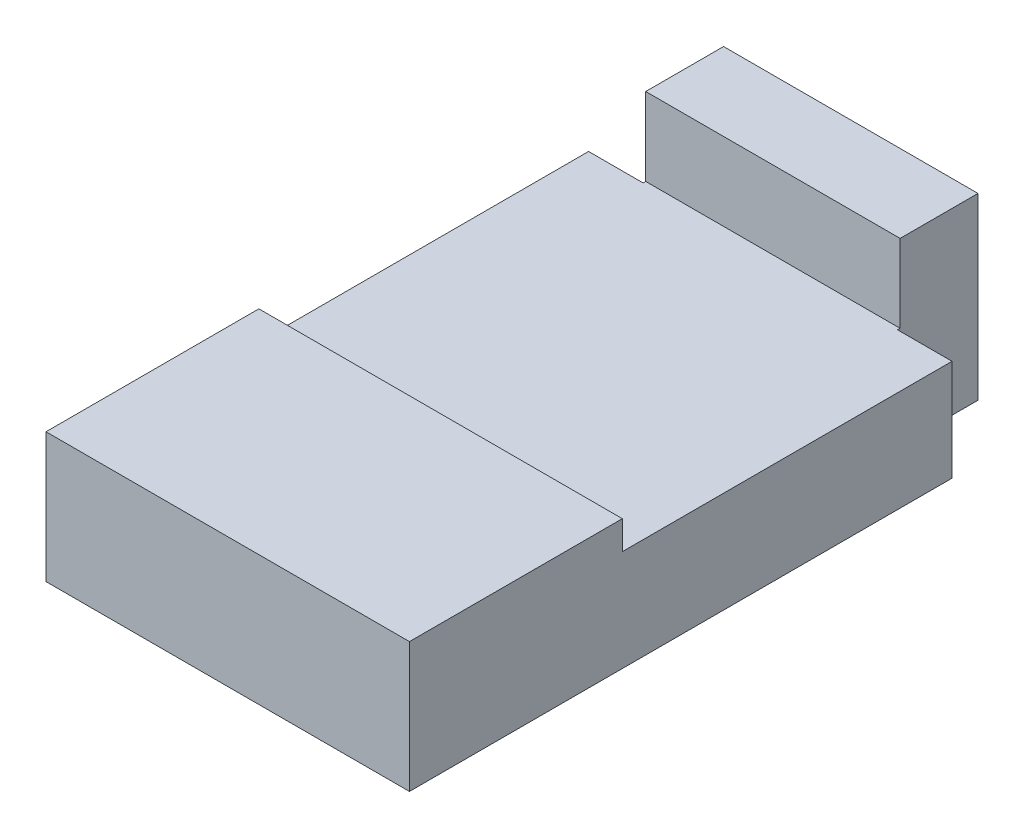
ISO-10303-21;
HEADER;
FILE_DESCRIPTION(('STEP AP214'),'2;1');
FILE_NAME('part.step','',(''),(''),'','','');
FILE_SCHEMA(('AUTOMOTIVE_DESIGN { 1 0 10303 214 1 1 1 1 }'));
ENDSEC;
DATA;
#1=APPLICATION_CONTEXT('core data for automotive mechanical design processes');
#2=APPLICATION_PROTOCOL_DEFINITION('international standard','automotive_design',2000,#1);
#3=PRODUCT_CONTEXT('',#1,'mechanical');
#4=PRODUCT('Part','Part','',(#3));
#5=PRODUCT_RELATED_PRODUCT_CATEGORY('part','',(#4));
#6=PRODUCT_DEFINITION_FORMATION('','',#4);
#7=PRODUCT_DEFINITION_CONTEXT('part definition',#1,'design');
#8=PRODUCT_DEFINITION('design','',#6,#7);
#9=PRODUCT_DEFINITION_SHAPE('','',#8);
#10=(LENGTH_UNIT() NAMED_UNIT(*) SI_UNIT(.MILLI.,.METRE.));
#11=(NAMED_UNIT(*) PLANE_ANGLE_UNIT() SI_UNIT($,.RADIAN.));
#12=(NAMED_UNIT(*) SI_UNIT($,.STERADIAN.) SOLID_ANGLE_UNIT());
#13=UNCERTAINTY_MEASURE_WITH_UNIT(LENGTH_MEASURE(1.E-05),#10,'distance_accuracy_value','');
#14=(GEOMETRIC_REPRESENTATION_CONTEXT(3) GLOBAL_UNCERTAINTY_ASSIGNED_CONTEXT((#13)) GLOBAL_UNIT_ASSIGNED_CONTEXT((#10,
#11,#12)) REPRESENTATION_CONTEXT('',''));
#15=CARTESIAN_POINT('',(0.,0.,0.));
#16=DIRECTION('',(0.,0.,1.));
#17=DIRECTION('',(1.,0.,0.));
#18=AXIS2_PLACEMENT_3D('',#15,#16,#17);
#19=CARTESIAN_POINT('',(-2.45,0.975,-3.));
#20=DIRECTION('',(0.,1.,0.));
#21=DIRECTION('',(0.,0.,1.));
#22=AXIS2_PLACEMENT_3D('',#19,#20,#21);
#23=PLANE('',#22);
#24=DIRECTION('',(0.,0.,1.));
#25=VECTOR('',#24,1.);
#26=CARTESIAN_POINT('',(-3.5,0.975,9.));
#27=LINE('',#26,#25);
#28=CARTESIAN_POINT('',(-3.5,0.975,-1.45));
#29=VERTEX_POINT('',#28);
#30=CARTESIAN_POINT('',(-3.5,0.975,4.9));
#31=VERTEX_POINT('',#30);
#32=EDGE_CURVE('E156',#29,#31,#27,.T.);
#33=ORIENTED_EDGE('',*,*,#32,.T.);
#34=DIRECTION('',(-1.,0.,0.));
#35=VECTOR('',#34,1.);
#36=CARTESIAN_POINT('',(-3.5,0.975,4.9));
#37=LINE('',#36,#35);
#38=CARTESIAN_POINT('',(3.5,0.975,4.9));
#39=VERTEX_POINT('',#38);
#40=EDGE_CURVE('E145',#39,#31,#37,.T.);
#41=ORIENTED_EDGE('',*,*,#40,.F.);
#42=DIRECTION('',(0.,0.,1.));
#43=VECTOR('',#42,1.);
#44=CARTESIAN_POINT('',(3.5,0.975,9.));
#45=LINE('',#44,#43);
#46=CARTESIAN_POINT('',(3.5,0.975,-1.45));
#47=VERTEX_POINT('',#46);
#48=EDGE_CURVE('E160',#47,#39,#45,.T.);
#49=ORIENTED_EDGE('',*,*,#48,.F.);
#50=DIRECTION('',(-1.,0.,0.));
#51=VECTOR('',#50,1.);
#52=CARTESIAN_POINT('',(3.5,0.975,-1.45));
#53=LINE('',#52,#51);
#54=CARTESIAN_POINT('',(2.45,0.975,-1.45));
#55=VERTEX_POINT('',#54);
#56=EDGE_CURVE('E170',#47,#55,#53,.T.);
#57=ORIENTED_EDGE('',*,*,#56,.T.);
#58=DIRECTION('',(0.,0.,1.));
#59=VECTOR('',#58,1.);
#60=CARTESIAN_POINT('',(2.45,0.975,-3.));
#61=LINE('',#60,#59);
#62=CARTESIAN_POINT('',(2.45,0.975,-1.5));
#63=VERTEX_POINT('',#62);
#64=EDGE_CURVE('E36',#63,#55,#61,.T.);
#65=ORIENTED_EDGE('',*,*,#64,.F.);
#66=DIRECTION('',(1.,0.,0.));
#67=VECTOR('',#66,1.);
#68=CARTESIAN_POINT('',(-2.45,0.975,-1.5));
#69=LINE('',#68,#67);
#70=CARTESIAN_POINT('',(-2.45,0.975,-1.5));
#71=VERTEX_POINT('',#70);
#72=EDGE_CURVE('E181',#71,#63,#69,.T.);
#73=ORIENTED_EDGE('',*,*,#72,.F.);
#74=DIRECTION('',(0.,0.,1.));
#75=VECTOR('',#74,1.);
#76=CARTESIAN_POINT('',(-2.45,0.975,-3.));
#77=LINE('',#76,#75);
#78=CARTESIAN_POINT('',(-2.45,0.975,-1.45));
#79=VERTEX_POINT('',#78);
#80=EDGE_CURVE('E211',#71,#79,#77,.T.);
#81=ORIENTED_EDGE('',*,*,#80,.T.);
#82=EDGE_CURVE('E162',#79,#29,#53,.T.);
#83=ORIENTED_EDGE('',*,*,#82,.T.);
#84=EDGE_LOOP('',(#33,#41,#49,#57,#65,#73,#81,#83));
#85=FACE_BOUND('',#84,.T.);
#86=ADVANCED_FACE('F32',(#85),#23,.T.);
#87=CARTESIAN_POINT('',(2.45,-0.975,-3.));
#88=DIRECTION('',(1.,0.,0.));
#89=DIRECTION('',(0.,0.,-1.));
#90=AXIS2_PLACEMENT_3D('',#87,#88,#89);
#91=PLANE('',#90);
#92=ORIENTED_EDGE('',*,*,#64,.T.);
#93=DIRECTION('',(0.,-1.,0.));
#94=VECTOR('',#93,1.);
#95=CARTESIAN_POINT('',(2.45,-0.975,-1.45));
#96=LINE('',#95,#94);
#97=CARTESIAN_POINT('',(2.45,-0.975,-1.45));
#98=VERTEX_POINT('',#97);
#99=EDGE_CURVE('E49',#55,#98,#96,.T.);
#100=ORIENTED_EDGE('',*,*,#99,.T.);
#101=DIRECTION('',(0.,0.,1.));
#102=VECTOR('',#101,1.);
#103=CARTESIAN_POINT('',(2.45,-0.975,-3.));
#104=LINE('',#103,#102);
#105=CARTESIAN_POINT('',(2.45,-0.975,-3.));
#106=VERTEX_POINT('',#105);
#107=EDGE_CURVE('E11',#106,#98,#104,.T.);
#108=ORIENTED_EDGE('',*,*,#107,.F.);
#109=DIRECTION('',(0.,1.,0.));
#110=VECTOR('',#109,1.);
#111=CARTESIAN_POINT('',(2.45,-0.975,-3.));
#112=LINE('',#111,#110);
#113=CARTESIAN_POINT('',(2.45,2.475,-3.));
#114=VERTEX_POINT('',#113);
#115=EDGE_CURVE('E202',#106,#114,#112,.T.);
#116=ORIENTED_EDGE('',*,*,#115,.T.);
#117=DIRECTION('',(0.,0.,-1.));
#118=VECTOR('',#117,1.);
#119=CARTESIAN_POINT('',(2.45,2.475,-3.));
#120=LINE('',#119,#118);
#121=CARTESIAN_POINT('',(2.45,2.475,-1.5));
#122=VERTEX_POINT('',#121);
#123=EDGE_CURVE('E187',#122,#114,#120,.T.);
#124=ORIENTED_EDGE('',*,*,#123,.F.);
#125=DIRECTION('',(0.,-1.,0.));
#126=VECTOR('',#125,1.);
#127=CARTESIAN_POINT('',(2.45,2.475,-1.5));
#128=LINE('',#127,#126);
#129=EDGE_CURVE('E193',#122,#63,#128,.T.);
#130=ORIENTED_EDGE('',*,*,#129,.T.);
#131=EDGE_LOOP('',(#92,#100,#108,#116,#124,#130));
#132=FACE_BOUND('',#131,.T.);
#133=ADVANCED_FACE('F34',(#132),#91,.T.);
#134=CARTESIAN_POINT('',(-2.45,-0.975,-3.));
#135=DIRECTION('',(-1.,0.,0.));
#136=DIRECTION('',(0.,0.,1.));
#137=AXIS2_PLACEMENT_3D('',#134,#135,#136);
#138=PLANE('',#137);
#139=DIRECTION('',(0.,0.,1.));
#140=VECTOR('',#139,1.);
#141=CARTESIAN_POINT('',(-2.45,-0.975,-3.));
#142=LINE('',#141,#140);
#143=CARTESIAN_POINT('',(-2.45,-0.975,-3.));
#144=VERTEX_POINT('',#143);
#145=CARTESIAN_POINT('',(-2.45,-0.975,-1.45));
#146=VERTEX_POINT('',#145);
#147=EDGE_CURVE('E41',#144,#146,#142,.T.);
#148=ORIENTED_EDGE('',*,*,#147,.T.);
#149=DIRECTION('',(0.,1.,0.));
#150=VECTOR('',#149,1.);
#151=CARTESIAN_POINT('',(-2.45,-0.975,-1.45));
#152=LINE('',#151,#150);
#153=EDGE_CURVE('E177',#146,#79,#152,.T.);
#154=ORIENTED_EDGE('',*,*,#153,.T.);
#155=ORIENTED_EDGE('',*,*,#80,.F.);
#156=DIRECTION('',(0.,-1.,0.));
#157=VECTOR('',#156,1.);
#158=CARTESIAN_POINT('',(-2.45,2.475,-1.5));
#159=LINE('',#158,#157);
#160=CARTESIAN_POINT('',(-2.45,2.475,-1.5));
#161=VERTEX_POINT('',#160);
#162=EDGE_CURVE('E197',#161,#71,#159,.T.);
#163=ORIENTED_EDGE('',*,*,#162,.F.);
#164=DIRECTION('',(0.,0.,1.));
#165=VECTOR('',#164,1.);
#166=CARTESIAN_POINT('',(-2.45,2.475,-3.));
#167=LINE('',#166,#165);
#168=CARTESIAN_POINT('',(-2.45,2.475,-3.));
#169=VERTEX_POINT('',#168);
#170=EDGE_CURVE('E182',#169,#161,#167,.T.);
#171=ORIENTED_EDGE('',*,*,#170,.F.);
#172=DIRECTION('',(0.,-1.,0.));
#173=VECTOR('',#172,1.);
#174=CARTESIAN_POINT('',(-2.45,-0.975,-3.));
#175=LINE('',#174,#173);
#176=EDGE_CURVE('E204',#169,#144,#175,.T.);
#177=ORIENTED_EDGE('',*,*,#176,.T.);
#178=EDGE_LOOP('',(#148,#154,#155,#163,#171,#177));
#179=FACE_BOUND('',#178,.T.);
#180=ADVANCED_FACE('F217',(#179),#138,.T.);
#181=CARTESIAN_POINT('',(-2.45,-0.975,-3.));
#182=DIRECTION('',(0.,-1.,0.));
#183=DIRECTION('',(0.,0.,-1.));
#184=AXIS2_PLACEMENT_3D('',#181,#182,#183);
#185=PLANE('',#184);
#186=DIRECTION('',(-1.,0.,0.));
#187=VECTOR('',#186,1.);
#188=CARTESIAN_POINT('',(3.5,-0.975,-1.45));
#189=LINE('',#188,#187);
#190=CARTESIAN_POINT('',(-3.5,-0.975,-1.45));
#191=VERTEX_POINT('',#190);
#192=EDGE_CURVE('E173',#146,#191,#189,.T.);
#193=ORIENTED_EDGE('',*,*,#192,.F.);
#194=ORIENTED_EDGE('',*,*,#147,.F.);
#195=DIRECTION('',(1.,0.,0.));
#196=VECTOR('',#195,1.);
#197=CARTESIAN_POINT('',(-2.45,-0.975,-3.));
#198=LINE('',#197,#196);
#199=EDGE_CURVE('E207',#144,#106,#198,.T.);
#200=ORIENTED_EDGE('',*,*,#199,.T.);
#201=ORIENTED_EDGE('',*,*,#107,.T.);
#202=CARTESIAN_POINT('',(3.5,-0.975,-1.45));
#203=VERTEX_POINT('',#202);
#204=EDGE_CURVE('E174',#203,#98,#189,.T.);
#205=ORIENTED_EDGE('',*,*,#204,.F.);
#206=DIRECTION('',(0.,0.,-1.));
#207=VECTOR('',#206,1.);
#208=CARTESIAN_POINT('',(3.5,-0.975,9.));
#209=LINE('',#208,#207);
#210=CARTESIAN_POINT('',(3.5,-0.975,9.));
#211=VERTEX_POINT('',#210);
#212=EDGE_CURVE('E155',#211,#203,#209,.T.);
#213=ORIENTED_EDGE('',*,*,#212,.F.);
#214=DIRECTION('',(1.,0.,0.));
#215=VECTOR('',#214,1.);
#216=CARTESIAN_POINT('',(-2.45,-0.975,9.));
#217=LINE('',#216,#215);
#218=CARTESIAN_POINT('',(-3.5,-0.975,9.));
#219=VERTEX_POINT('',#218);
#220=EDGE_CURVE('E200',#219,#211,#217,.T.);
#221=ORIENTED_EDGE('',*,*,#220,.F.);
#222=DIRECTION('',(0.,0.,-1.));
#223=VECTOR('',#222,1.);
#224=CARTESIAN_POINT('',(-3.5,-0.975,9.));
#225=LINE('',#224,#223);
#226=EDGE_CURVE('E128',#219,#191,#225,.T.);
#227=ORIENTED_EDGE('',*,*,#226,.T.);
#228=EDGE_LOOP('',(#193,#194,#200,#201,#205,#213,#221,#227));
#229=FACE_BOUND('',#228,.T.);
#230=ADVANCED_FACE('F232',(#229),#185,.T.);
#231=CARTESIAN_POINT('',(0.,0.,-3.));
#232=DIRECTION('',(0.,0.,-1.));
#233=DIRECTION('',(-1.,0.,0.));
#234=AXIS2_PLACEMENT_3D('',#231,#232,#233);
#235=PLANE('',#234);
#236=ORIENTED_EDGE('',*,*,#115,.F.);
#237=ORIENTED_EDGE('',*,*,#199,.F.);
#238=ORIENTED_EDGE('',*,*,#176,.F.);
#239=DIRECTION('',(-1.,0.,0.));
#240=VECTOR('',#239,1.);
#241=CARTESIAN_POINT('',(-2.45,2.475,-3.));
#242=LINE('',#241,#240);
#243=EDGE_CURVE('E190',#114,#169,#242,.T.);
#244=ORIENTED_EDGE('',*,*,#243,.F.);
#245=EDGE_LOOP('',(#236,#237,#238,#244));
#246=FACE_BOUND('',#245,.T.);
#247=ADVANCED_FACE('F229',(#246),#235,.T.);
#248=CARTESIAN_POINT('',(0.,0.,9.));
#249=DIRECTION('',(0.,0.,-1.));
#250=DIRECTION('',(-1.,0.,0.));
#251=AXIS2_PLACEMENT_3D('',#248,#249,#250);
#252=PLANE('',#251);
#253=ORIENTED_EDGE('',*,*,#220,.T.);
#254=DIRECTION('',(0.,-1.,0.));
#255=VECTOR('',#254,1.);
#256=CARTESIAN_POINT('',(3.5,-0.975,9.));
#257=LINE('',#256,#255);
#258=CARTESIAN_POINT('',(3.5,1.525,9.));
#259=VERTEX_POINT('',#258);
#260=EDGE_CURVE('E136',#259,#211,#257,.T.);
#261=ORIENTED_EDGE('',*,*,#260,.F.);
#262=DIRECTION('',(1.,0.,0.));
#263=VECTOR('',#262,1.);
#264=CARTESIAN_POINT('',(-3.5,1.525,9.));
#265=LINE('',#264,#263);
#266=CARTESIAN_POINT('',(-3.5,1.525,9.));
#267=VERTEX_POINT('',#266);
#268=EDGE_CURVE('E133',#267,#259,#265,.T.);
#269=ORIENTED_EDGE('',*,*,#268,.F.);
#270=DIRECTION('',(0.,-1.,0.));
#271=VECTOR('',#270,1.);
#272=CARTESIAN_POINT('',(-3.5,-0.975,9.));
#273=LINE('',#272,#271);
#274=EDGE_CURVE('E120',#267,#219,#273,.T.);
#275=ORIENTED_EDGE('',*,*,#274,.T.);
#276=EDGE_LOOP('',(#253,#261,#269,#275));
#277=FACE_BOUND('',#276,.T.);
#278=ADVANCED_FACE('F134',(#277),#252,.F.);
#279=CARTESIAN_POINT('',(-2.45,2.475,-1.5));
#280=DIRECTION('',(0.,0.,-1.));
#281=DIRECTION('',(-1.,0.,0.));
#282=AXIS2_PLACEMENT_3D('',#279,#280,#281);
#283=PLANE('',#282);
#284=ORIENTED_EDGE('',*,*,#72,.T.);
#285=ORIENTED_EDGE('',*,*,#129,.F.);
#286=DIRECTION('',(1.,0.,0.));
#287=VECTOR('',#286,1.);
#288=CARTESIAN_POINT('',(-2.45,2.475,-1.5));
#289=LINE('',#288,#287);
#290=EDGE_CURVE('E185',#161,#122,#289,.T.);
#291=ORIENTED_EDGE('',*,*,#290,.F.);
#292=ORIENTED_EDGE('',*,*,#162,.T.);
#293=EDGE_LOOP('',(#284,#285,#291,#292));
#294=FACE_BOUND('',#293,.T.);
#295=ADVANCED_FACE('F220',(#294),#283,.F.);
#296=CARTESIAN_POINT('',(0.,2.475,0.));
#297=DIRECTION('',(0.,1.,0.));
#298=DIRECTION('',(0.,0.,1.));
#299=AXIS2_PLACEMENT_3D('',#296,#297,#298);
#300=PLANE('',#299);
#301=ORIENTED_EDGE('',*,*,#170,.T.);
#302=ORIENTED_EDGE('',*,*,#290,.T.);
#303=ORIENTED_EDGE('',*,*,#123,.T.);
#304=ORIENTED_EDGE('',*,*,#243,.T.);
#305=EDGE_LOOP('',(#301,#302,#303,#304));
#306=FACE_BOUND('',#305,.T.);
#307=ADVANCED_FACE('F224',(#306),#300,.T.);
#308=CARTESIAN_POINT('',(-3.5,0.,0.));
#309=DIRECTION('',(-1.,0.,0.));
#310=DIRECTION('',(0.,0.,1.));
#311=AXIS2_PLACEMENT_3D('',#308,#309,#310);
#312=PLANE('',#311);
#313=ORIENTED_EDGE('',*,*,#274,.F.);
#314=DIRECTION('',(0.,0.,1.));
#315=VECTOR('',#314,1.);
#316=CARTESIAN_POINT('',(-3.5,1.525,9.));
#317=LINE('',#316,#315);
#318=CARTESIAN_POINT('',(-3.5,1.525,4.9));
#319=VERTEX_POINT('',#318);
#320=EDGE_CURVE('E125',#319,#267,#317,.T.);
#321=ORIENTED_EDGE('',*,*,#320,.F.);
#322=DIRECTION('',(0.,-1.,0.));
#323=VECTOR('',#322,1.);
#324=CARTESIAN_POINT('',(-3.5,1.525,4.9));
#325=LINE('',#324,#323);
#326=EDGE_CURVE('E150',#319,#31,#325,.T.);
#327=ORIENTED_EDGE('',*,*,#326,.T.);
#328=ORIENTED_EDGE('',*,*,#32,.F.);
#329=DIRECTION('',(0.,1.,0.));
#330=VECTOR('',#329,1.);
#331=CARTESIAN_POINT('',(-3.5,-0.975,-1.45));
#332=LINE('',#331,#330);
#333=EDGE_CURVE('E165',#191,#29,#332,.T.);
#334=ORIENTED_EDGE('',*,*,#333,.F.);
#335=ORIENTED_EDGE('',*,*,#226,.F.);
#336=EDGE_LOOP('',(#313,#321,#327,#328,#334,#335));
#337=FACE_BOUND('',#336,.T.);
#338=ADVANCED_FACE('F122',(#337),#312,.T.);
#339=CARTESIAN_POINT('',(3.5,-0.975,-1.45));
#340=DIRECTION('',(0.,0.,1.));
#341=DIRECTION('',(1.,0.,0.));
#342=AXIS2_PLACEMENT_3D('',#339,#340,#341);
#343=PLANE('',#342);
#344=ORIENTED_EDGE('',*,*,#153,.F.);
#345=ORIENTED_EDGE('',*,*,#192,.T.);
#346=ORIENTED_EDGE('',*,*,#333,.T.);
#347=ORIENTED_EDGE('',*,*,#82,.F.);
#348=EDGE_LOOP('',(#344,#345,#346,#347));
#349=FACE_BOUND('',#348,.T.);
#350=ADVANCED_FACE('F235',(#349),#343,.F.);
#351=ORIENTED_EDGE('',*,*,#99,.F.);
#352=ORIENTED_EDGE('',*,*,#56,.F.);
#353=DIRECTION('',(0.,1.,0.));
#354=VECTOR('',#353,1.);
#355=CARTESIAN_POINT('',(3.5,-0.975,-1.45));
#356=LINE('',#355,#354);
#357=EDGE_CURVE('E158',#203,#47,#356,.T.);
#358=ORIENTED_EDGE('',*,*,#357,.F.);
#359=ORIENTED_EDGE('',*,*,#204,.T.);
#360=EDGE_LOOP('',(#351,#352,#358,#359));
#361=FACE_BOUND('',#360,.T.);
#362=ADVANCED_FACE('F247',(#361),#343,.F.);
#363=CARTESIAN_POINT('',(3.5,0.,0.));
#364=DIRECTION('',(-1.,0.,0.));
#365=DIRECTION('',(0.,0.,1.));
#366=AXIS2_PLACEMENT_3D('',#363,#364,#365);
#367=PLANE('',#366);
#368=ORIENTED_EDGE('',*,*,#260,.T.);
#369=ORIENTED_EDGE('',*,*,#212,.T.);
#370=ORIENTED_EDGE('',*,*,#357,.T.);
#371=ORIENTED_EDGE('',*,*,#48,.T.);
#372=DIRECTION('',(0.,-1.,0.));
#373=VECTOR('',#372,1.);
#374=CARTESIAN_POINT('',(3.5,1.525,4.9));
#375=LINE('',#374,#373);
#376=CARTESIAN_POINT('',(3.5,1.525,4.9));
#377=VERTEX_POINT('',#376);
#378=EDGE_CURVE('E130',#377,#39,#375,.T.);
#379=ORIENTED_EDGE('',*,*,#378,.F.);
#380=DIRECTION('',(0.,0.,-1.));
#381=VECTOR('',#380,1.);
#382=CARTESIAN_POINT('',(3.5,1.525,9.));
#383=LINE('',#382,#381);
#384=EDGE_CURVE('E139',#259,#377,#383,.T.);
#385=ORIENTED_EDGE('',*,*,#384,.F.);
#386=EDGE_LOOP('',(#368,#369,#370,#371,#379,#385));
#387=FACE_BOUND('',#386,.T.);
#388=ADVANCED_FACE('F242',(#387),#367,.F.);
#389=CARTESIAN_POINT('',(-3.5,1.525,4.9));
#390=DIRECTION('',(0.,0.,1.));
#391=DIRECTION('',(1.,0.,0.));
#392=AXIS2_PLACEMENT_3D('',#389,#390,#391);
#393=PLANE('',#392);
#394=ORIENTED_EDGE('',*,*,#40,.T.);
#395=ORIENTED_EDGE('',*,*,#326,.F.);
#396=DIRECTION('',(-1.,0.,0.));
#397=VECTOR('',#396,1.);
#398=CARTESIAN_POINT('',(-3.5,1.525,4.9));
#399=LINE('',#398,#397);
#400=EDGE_CURVE('E143',#377,#319,#399,.T.);
#401=ORIENTED_EDGE('',*,*,#400,.F.);
#402=ORIENTED_EDGE('',*,*,#378,.T.);
#403=EDGE_LOOP('',(#394,#395,#401,#402));
#404=FACE_BOUND('',#403,.T.);
#405=ADVANCED_FACE('F254',(#404),#393,.F.);
#406=CARTESIAN_POINT('',(0.,1.525,0.));
#407=DIRECTION('',(0.,-1.,0.));
#408=DIRECTION('',(0.,0.,-1.));
#409=AXIS2_PLACEMENT_3D('',#406,#407,#408);
#410=PLANE('',#409);
#411=ORIENTED_EDGE('',*,*,#320,.T.);
#412=ORIENTED_EDGE('',*,*,#268,.T.);
#413=ORIENTED_EDGE('',*,*,#384,.T.);
#414=ORIENTED_EDGE('',*,*,#400,.T.);
#415=EDGE_LOOP('',(#411,#412,#413,#414));
#416=FACE_BOUND('',#415,.T.);
#417=ADVANCED_FACE('F141',(#416),#410,.F.);
#418=CLOSED_SHELL('',(#86,#133,#180,#230,#247,#278,#295,#307,#338,#350,#362,#388,#405,#417));
#419=MANIFOLD_SOLID_BREP('B2',#418);
#420=ADVANCED_BREP_SHAPE_REPRESENTATION('',(#18,#419),#14);
#421=SHAPE_DEFINITION_REPRESENTATION(#9,#420);
ENDSEC;
END-ISO-10303-21;
